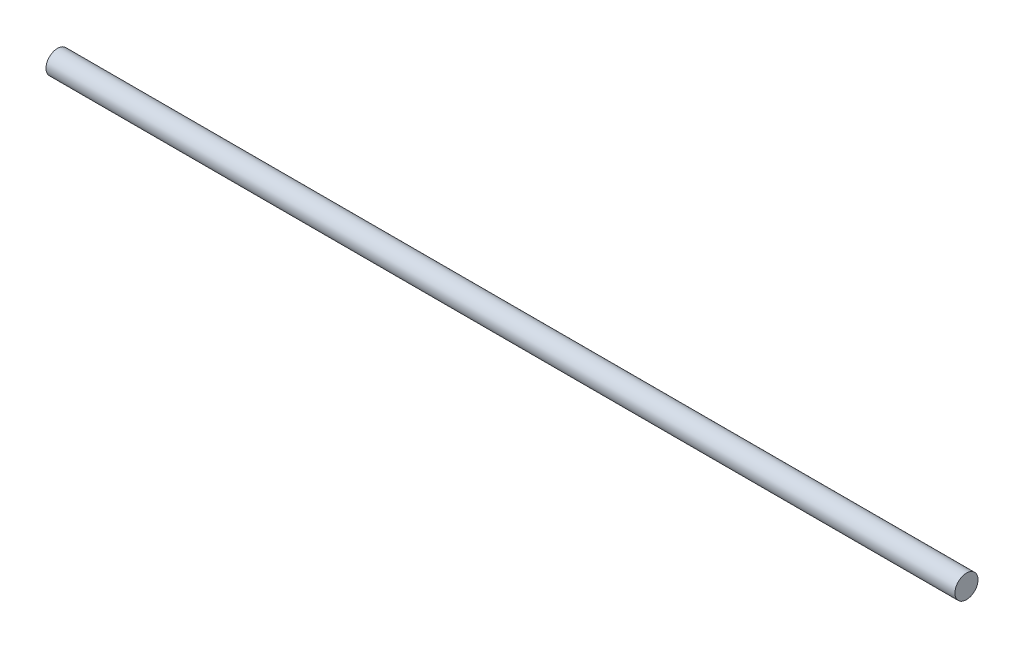
ISO-10303-21;
HEADER;
FILE_DESCRIPTION(('STEP AP214'),'2;1');
FILE_NAME('part.step','',(''),(''),'','','');
FILE_SCHEMA(('AUTOMOTIVE_DESIGN { 1 0 10303 214 1 1 1 1 }'));
ENDSEC;
DATA;
#1=APPLICATION_CONTEXT('core data for automotive mechanical design processes');
#2=APPLICATION_PROTOCOL_DEFINITION('international standard','automotive_design',2000,#1);
#3=PRODUCT_CONTEXT('',#1,'mechanical');
#4=PRODUCT('Part','Part','',(#3));
#5=PRODUCT_RELATED_PRODUCT_CATEGORY('part','',(#4));
#6=PRODUCT_DEFINITION_FORMATION('','',#4);
#7=PRODUCT_DEFINITION_CONTEXT('part definition',#1,'design');
#8=PRODUCT_DEFINITION('design','',#6,#7);
#9=PRODUCT_DEFINITION_SHAPE('','',#8);
#10=(LENGTH_UNIT() NAMED_UNIT(*) SI_UNIT(.MILLI.,.METRE.));
#11=(NAMED_UNIT(*) PLANE_ANGLE_UNIT() SI_UNIT($,.RADIAN.));
#12=(NAMED_UNIT(*) SI_UNIT($,.STERADIAN.) SOLID_ANGLE_UNIT());
#13=UNCERTAINTY_MEASURE_WITH_UNIT(LENGTH_MEASURE(1.E-05),#10,'distance_accuracy_value','');
#14=(GEOMETRIC_REPRESENTATION_CONTEXT(3) GLOBAL_UNCERTAINTY_ASSIGNED_CONTEXT((#13)) GLOBAL_UNIT_ASSIGNED_CONTEXT((#10,
#11,#12)) REPRESENTATION_CONTEXT('',''));
#15=CARTESIAN_POINT('',(0.,0.,0.));
#16=DIRECTION('',(0.,0.,1.));
#17=DIRECTION('',(1.,0.,0.));
#18=AXIS2_PLACEMENT_3D('',#15,#16,#17);
#19=CARTESIAN_POINT('',(500.,0.,0.));
#20=DIRECTION('',(-1.,0.,0.));
#21=DIRECTION('',(0.,0.,1.));
#22=AXIS2_PLACEMENT_3D('',#19,#20,#21);
#23=CYLINDRICAL_SURFACE('',#22,6.35);
#24=CARTESIAN_POINT('',(500.,0.,0.));
#25=DIRECTION('',(1.,0.,0.));
#26=DIRECTION('',(0.,0.,-1.));
#27=AXIS2_PLACEMENT_3D('',#24,#25,#26);
#28=CIRCLE('',#27,6.35);
#29=CARTESIAN_POINT('',(500.,0.,-6.35));
#30=VERTEX_POINT('',#29);
#31=EDGE_CURVE('E10',#30,#30,#28,.T.);
#32=ORIENTED_EDGE('',*,*,#31,.F.);
#33=EDGE_LOOP('',(#32));
#34=FACE_BOUND('',#33,.T.);
#35=CARTESIAN_POINT('',(0.,0.,0.));
#36=DIRECTION('',(1.,0.,0.));
#37=DIRECTION('',(0.,0.,-1.));
#38=AXIS2_PLACEMENT_3D('',#35,#36,#37);
#39=CIRCLE('',#38,6.35);
#40=CARTESIAN_POINT('',(0.,0.,-6.35));
#41=VERTEX_POINT('',#40);
#42=EDGE_CURVE('E40',#41,#41,#39,.T.);
#43=ORIENTED_EDGE('',*,*,#42,.T.);
#44=EDGE_LOOP('',(#43));
#45=FACE_BOUND('',#44,.T.);
#46=ADVANCED_FACE('F37',(#34,#45),#23,.T.);
#47=CARTESIAN_POINT('',(500.,0.,0.));
#48=DIRECTION('',(1.,0.,0.));
#49=DIRECTION('',(0.,0.,-1.));
#50=AXIS2_PLACEMENT_3D('',#47,#48,#49);
#51=PLANE('',#50);
#52=ORIENTED_EDGE('',*,*,#31,.T.);
#53=EDGE_LOOP('',(#52));
#54=FACE_BOUND('',#53,.T.);
#55=ADVANCED_FACE('F52',(#54),#51,.T.);
#56=CARTESIAN_POINT('',(0.,0.,0.));
#57=DIRECTION('',(1.,0.,0.));
#58=DIRECTION('',(0.,0.,-1.));
#59=AXIS2_PLACEMENT_3D('',#56,#57,#58);
#60=PLANE('',#59);
#61=ORIENTED_EDGE('',*,*,#42,.F.);
#62=EDGE_LOOP('',(#61));
#63=FACE_BOUND('',#62,.T.);
#64=ADVANCED_FACE('F50',(#63),#60,.F.);
#65=CLOSED_SHELL('',(#46,#55,#64));
#66=MANIFOLD_SOLID_BREP('B2',#65);
#67=ADVANCED_BREP_SHAPE_REPRESENTATION('',(#18,#66),#14);
#68=SHAPE_DEFINITION_REPRESENTATION(#9,#67);
ENDSEC;
END-ISO-10303-21;
